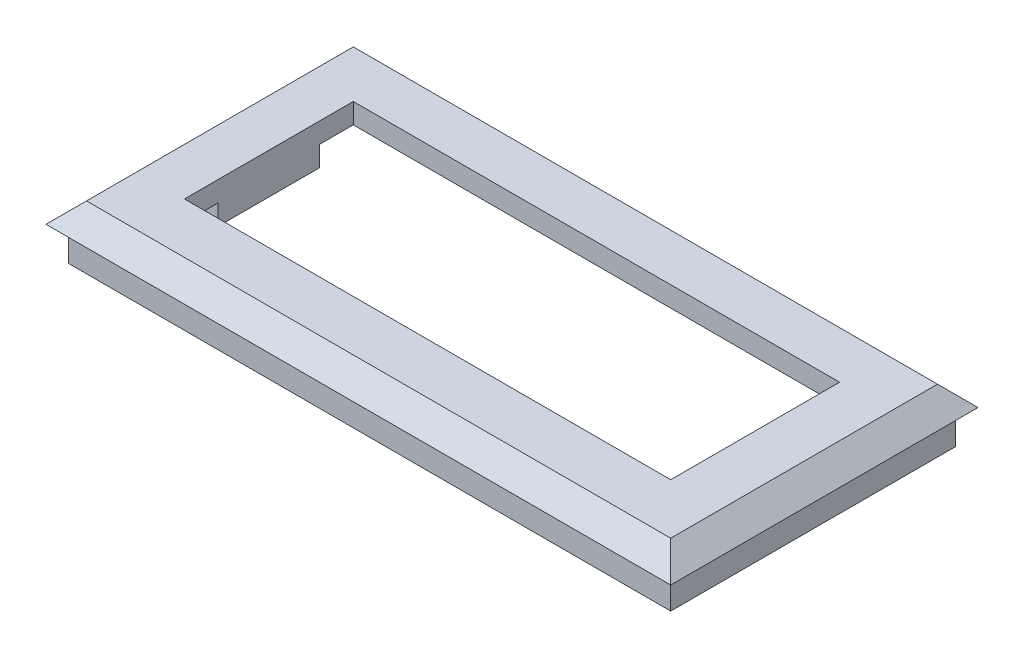
ISO-10303-21;
HEADER;
FILE_DESCRIPTION(('STEP AP214'),'2;1');
FILE_NAME('part.step','',(''),(''),'','','');
FILE_SCHEMA(('AUTOMOTIVE_DESIGN { 1 0 10303 214 1 1 1 1 }'));
ENDSEC;
DATA;
#1=APPLICATION_CONTEXT('core data for automotive mechanical design processes');
#2=APPLICATION_PROTOCOL_DEFINITION('international standard','automotive_design',2000,#1);
#3=PRODUCT_CONTEXT('',#1,'mechanical');
#4=PRODUCT('Part','Part','',(#3));
#5=PRODUCT_RELATED_PRODUCT_CATEGORY('part','',(#4));
#6=PRODUCT_DEFINITION_FORMATION('','',#4);
#7=PRODUCT_DEFINITION_CONTEXT('part definition',#1,'design');
#8=PRODUCT_DEFINITION('design','',#6,#7);
#9=PRODUCT_DEFINITION_SHAPE('','',#8);
#10=(LENGTH_UNIT() NAMED_UNIT(*) SI_UNIT(.MILLI.,.METRE.));
#11=(NAMED_UNIT(*) PLANE_ANGLE_UNIT() SI_UNIT($,.RADIAN.));
#12=(NAMED_UNIT(*) SI_UNIT($,.STERADIAN.) SOLID_ANGLE_UNIT());
#13=UNCERTAINTY_MEASURE_WITH_UNIT(LENGTH_MEASURE(1.E-05),#10,'distance_accuracy_value','');
#14=(GEOMETRIC_REPRESENTATION_CONTEXT(3) GLOBAL_UNCERTAINTY_ASSIGNED_CONTEXT((#13)) GLOBAL_UNIT_ASSIGNED_CONTEXT((#10,
#11,#12)) REPRESENTATION_CONTEXT('',''));
#15=CARTESIAN_POINT('',(0.,0.,0.));
#16=DIRECTION('',(0.,0.,1.));
#17=DIRECTION('',(1.,0.,0.));
#18=AXIS2_PLACEMENT_3D('',#15,#16,#17);
#19=CARTESIAN_POINT('',(0.,-3.,0.));
#20=DIRECTION('',(0.,1.,0.));
#21=DIRECTION('',(0.,0.,1.));
#22=AXIS2_PLACEMENT_3D('',#19,#20,#21);
#23=PLANE('',#22);
#24=DIRECTION('',(0.,0.,1.));
#25=VECTOR('',#24,1.);
#26=CARTESIAN_POINT('',(-46.,-3.,-22.5));
#27=LINE('',#26,#25);
#28=CARTESIAN_POINT('',(-46.,-3.,-22.5));
#29=VERTEX_POINT('',#28);
#30=CARTESIAN_POINT('',(-46.,-3.,23.));
#31=VERTEX_POINT('',#30);
#32=EDGE_CURVE('E159',#29,#31,#27,.T.);
#33=ORIENTED_EDGE('',*,*,#32,.F.);
#34=DIRECTION('',(-1.,0.,0.));
#35=VECTOR('',#34,1.);
#36=CARTESIAN_POINT('',(46.5,-3.,-22.5));
#37=LINE('',#36,#35);
#38=CARTESIAN_POINT('',(46.5,-3.,-22.5));
#39=VERTEX_POINT('',#38);
#40=EDGE_CURVE('E537',#39,#29,#37,.T.);
#41=ORIENTED_EDGE('',*,*,#40,.F.);
#42=DIRECTION('',(0.,0.,-1.));
#43=VECTOR('',#42,1.);
#44=CARTESIAN_POINT('',(46.5,-3.,23.));
#45=LINE('',#44,#43);
#46=CARTESIAN_POINT('',(46.5,-3.,23.));
#47=VERTEX_POINT('',#46);
#48=EDGE_CURVE('E454',#47,#39,#45,.T.);
#49=ORIENTED_EDGE('',*,*,#48,.F.);
#50=DIRECTION('',(1.,0.,0.));
#51=VECTOR('',#50,1.);
#52=CARTESIAN_POINT('',(-46.,-3.,23.));
#53=LINE('',#52,#51);
#54=EDGE_CURVE('E13',#31,#47,#53,.T.);
#55=ORIENTED_EDGE('',*,*,#54,.F.);
#56=EDGE_LOOP('',(#33,#41,#49,#55));
#57=FACE_BOUND('',#56,.T.);
#58=DIRECTION('',(0.,0.,-1.));
#59=VECTOR('',#58,1.);
#60=CARTESIAN_POINT('',(-44.35,-3.,21.35));
#61=LINE('',#60,#59);
#62=CARTESIAN_POINT('',(-44.35,-3.,21.35));
#63=VERTEX_POINT('',#62);
#64=CARTESIAN_POINT('',(-44.35,-3.,-20.85));
#65=VERTEX_POINT('',#64);
#66=EDGE_CURVE('E306',#63,#65,#61,.T.);
#67=ORIENTED_EDGE('',*,*,#66,.F.);
#68=DIRECTION('',(-1.,0.,0.));
#69=VECTOR('',#68,1.);
#70=CARTESIAN_POINT('',(-44.35,-3.,21.35));
#71=LINE('',#70,#69);
#72=CARTESIAN_POINT('',(44.85,-3.,21.35));
#73=VERTEX_POINT('',#72);
#74=EDGE_CURVE('E334',#73,#63,#71,.T.);
#75=ORIENTED_EDGE('',*,*,#74,.F.);
#76=DIRECTION('',(0.,0.,1.));
#77=VECTOR('',#76,1.);
#78=CARTESIAN_POINT('',(44.85,-3.,21.35));
#79=LINE('',#78,#77);
#80=CARTESIAN_POINT('',(44.85,-3.,-20.85));
#81=VERTEX_POINT('',#80);
#82=EDGE_CURVE('E172',#81,#73,#79,.T.);
#83=ORIENTED_EDGE('',*,*,#82,.F.);
#84=DIRECTION('',(1.,0.,0.));
#85=VECTOR('',#84,1.);
#86=CARTESIAN_POINT('',(-44.35,-3.,-20.85));
#87=LINE('',#86,#85);
#88=EDGE_CURVE('E167',#65,#81,#87,.T.);
#89=ORIENTED_EDGE('',*,*,#88,.F.);
#90=EDGE_LOOP('',(#67,#75,#83,#89));
#91=FACE_BOUND('',#90,.T.);
#92=ADVANCED_FACE('F147',(#57,#91),#23,.F.);
#93=DIRECTION('',(-1.,0.,0.));
#94=VECTOR('',#93,1.);
#95=CARTESIAN_POINT('',(-42.85,-3.,19.85));
#96=LINE('',#95,#94);
#97=CARTESIAN_POINT('',(43.35,-3.,19.85));
#98=VERTEX_POINT('',#97);
#99=CARTESIAN_POINT('',(-42.85,-3.,19.85));
#100=VERTEX_POINT('',#99);
#101=EDGE_CURVE('E299',#98,#100,#96,.T.);
#102=ORIENTED_EDGE('',*,*,#101,.T.);
#103=DIRECTION('',(0.,0.,-1.));
#104=VECTOR('',#103,1.);
#105=CARTESIAN_POINT('',(-42.85,-3.,19.85));
#106=LINE('',#105,#104);
#107=CARTESIAN_POINT('',(-42.85,-3.,-19.35));
#108=VERTEX_POINT('',#107);
#109=EDGE_CURVE('E318',#100,#108,#106,.T.);
#110=ORIENTED_EDGE('',*,*,#109,.T.);
#111=DIRECTION('',(1.,0.,0.));
#112=VECTOR('',#111,1.);
#113=CARTESIAN_POINT('',(-42.85,-3.,-19.35));
#114=LINE('',#113,#112);
#115=CARTESIAN_POINT('',(43.35,-3.,-19.35));
#116=VERTEX_POINT('',#115);
#117=EDGE_CURVE('E305',#108,#116,#114,.T.);
#118=ORIENTED_EDGE('',*,*,#117,.T.);
#119=DIRECTION('',(0.,0.,1.));
#120=VECTOR('',#119,1.);
#121=CARTESIAN_POINT('',(43.35,-3.,19.85));
#122=LINE('',#121,#120);
#123=EDGE_CURVE('E321',#116,#98,#122,.T.);
#124=ORIENTED_EDGE('',*,*,#123,.T.);
#125=EDGE_LOOP('',(#102,#110,#118,#124));
#126=FACE_BOUND('',#125,.T.);
#127=DIRECTION('',(-1.,0.,0.));
#128=VECTOR('',#127,1.);
#129=CARTESIAN_POINT('',(-36.,-3.,7.5));
#130=LINE('',#129,#128);
#131=CARTESIAN_POINT('',(-36.,-3.,7.5));
#132=VERTEX_POINT('',#131);
#133=CARTESIAN_POINT('',(-40.,-3.,7.5));
#134=VERTEX_POINT('',#133);
#135=EDGE_CURVE('E357',#132,#134,#130,.T.);
#136=ORIENTED_EDGE('',*,*,#135,.F.);
#137=DIRECTION('',(0.,0.,1.));
#138=VECTOR('',#137,1.);
#139=CARTESIAN_POINT('',(-36.,-3.,0.));
#140=LINE('',#139,#138);
#141=CARTESIAN_POINT('',(-36.,-3.,12.5));
#142=VERTEX_POINT('',#141);
#143=EDGE_CURVE('E413',#132,#142,#140,.T.);
#144=ORIENTED_EDGE('',*,*,#143,.T.);
#145=DIRECTION('',(1.,0.,0.));
#146=VECTOR('',#145,1.);
#147=CARTESIAN_POINT('',(0.,-3.,12.5));
#148=LINE('',#147,#146);
#149=CARTESIAN_POINT('',(36.,-3.,12.5));
#150=VERTEX_POINT('',#149);
#151=EDGE_CURVE('E416',#142,#150,#148,.T.);
#152=ORIENTED_EDGE('',*,*,#151,.T.);
#153=DIRECTION('',(0.,0.,-1.));
#154=VECTOR('',#153,1.);
#155=CARTESIAN_POINT('',(36.,-3.,0.));
#156=LINE('',#155,#154);
#157=CARTESIAN_POINT('',(36.,-3.,-12.5));
#158=VERTEX_POINT('',#157);
#159=EDGE_CURVE('E401',#150,#158,#156,.T.);
#160=ORIENTED_EDGE('',*,*,#159,.T.);
#161=DIRECTION('',(-1.,0.,0.));
#162=VECTOR('',#161,1.);
#163=CARTESIAN_POINT('',(0.,-3.,-12.5));
#164=LINE('',#163,#162);
#165=CARTESIAN_POINT('',(-36.,-3.,-12.5));
#166=VERTEX_POINT('',#165);
#167=EDGE_CURVE('E410',#158,#166,#164,.T.);
#168=ORIENTED_EDGE('',*,*,#167,.T.);
#169=CARTESIAN_POINT('',(-36.,-3.,-7.5));
#170=VERTEX_POINT('',#169);
#171=EDGE_CURVE('E414',#166,#170,#140,.T.);
#172=ORIENTED_EDGE('',*,*,#171,.T.);
#173=DIRECTION('',(1.,0.,0.));
#174=VECTOR('',#173,1.);
#175=CARTESIAN_POINT('',(-36.,-3.,-7.5));
#176=LINE('',#175,#174);
#177=CARTESIAN_POINT('',(-40.,-3.,-7.5));
#178=VERTEX_POINT('',#177);
#179=EDGE_CURVE('E362',#178,#170,#176,.T.);
#180=ORIENTED_EDGE('',*,*,#179,.F.);
#181=DIRECTION('',(0.,0.,-1.));
#182=VECTOR('',#181,1.);
#183=CARTESIAN_POINT('',(-40.,-3.,7.5));
#184=LINE('',#183,#182);
#185=EDGE_CURVE('E371',#134,#178,#184,.T.);
#186=ORIENTED_EDGE('',*,*,#185,.F.);
#187=EDGE_LOOP('',(#136,#144,#152,#160,#168,#172,#180,#186));
#188=FACE_BOUND('',#187,.T.);
#189=ADVANCED_FACE('F492',(#126,#188),#23,.F.);
#190=CARTESIAN_POINT('',(0.,0.,0.));
#191=DIRECTION('',(0.,1.,0.));
#192=DIRECTION('',(0.,0.,1.));
#193=AXIS2_PLACEMENT_3D('',#190,#191,#192);
#194=PLANE('',#193);
#195=DIRECTION('',(1.,0.,0.));
#196=VECTOR('',#195,1.);
#197=CARTESIAN_POINT('',(-36.,0.,12.5));
#198=LINE('',#197,#196);
#199=CARTESIAN_POINT('',(-36.,0.,12.5));
#200=VERTEX_POINT('',#199);
#201=CARTESIAN_POINT('',(36.,0.,12.5));
#202=VERTEX_POINT('',#201);
#203=EDGE_CURVE('E387',#200,#202,#198,.T.);
#204=ORIENTED_EDGE('',*,*,#203,.F.);
#205=DIRECTION('',(0.,0.,1.));
#206=VECTOR('',#205,1.);
#207=CARTESIAN_POINT('',(-36.,0.,12.5));
#208=LINE('',#207,#206);
#209=CARTESIAN_POINT('',(-36.,0.,-12.5));
#210=VERTEX_POINT('',#209);
#211=EDGE_CURVE('E395',#210,#200,#208,.T.);
#212=ORIENTED_EDGE('',*,*,#211,.F.);
#213=DIRECTION('',(-1.,0.,0.));
#214=VECTOR('',#213,1.);
#215=CARTESIAN_POINT('',(-36.,0.,-12.5));
#216=LINE('',#215,#214);
#217=CARTESIAN_POINT('',(36.,0.,-12.5));
#218=VERTEX_POINT('',#217);
#219=EDGE_CURVE('E392',#218,#210,#216,.T.);
#220=ORIENTED_EDGE('',*,*,#219,.F.);
#221=DIRECTION('',(0.,0.,-1.));
#222=VECTOR('',#221,1.);
#223=CARTESIAN_POINT('',(36.,0.,12.5));
#224=LINE('',#223,#222);
#225=EDGE_CURVE('E389',#202,#218,#224,.T.);
#226=ORIENTED_EDGE('',*,*,#225,.F.);
#227=EDGE_LOOP('',(#204,#212,#220,#226));
#228=FACE_BOUND('',#227,.T.);
#229=DIRECTION('',(0.,0.,1.));
#230=VECTOR('',#229,1.);
#231=CARTESIAN_POINT('',(-43.,0.,-19.5));
#232=LINE('',#231,#230);
#233=CARTESIAN_POINT('',(-43.,0.,-19.5));
#234=VERTEX_POINT('',#233);
#235=CARTESIAN_POINT('',(-43.,0.,20.));
#236=VERTEX_POINT('',#235);
#237=EDGE_CURVE('E419',#234,#236,#232,.T.);
#238=ORIENTED_EDGE('',*,*,#237,.T.);
#239=DIRECTION('',(1.,0.,0.));
#240=VECTOR('',#239,1.);
#241=CARTESIAN_POINT('',(-43.,0.,20.));
#242=LINE('',#241,#240);
#243=CARTESIAN_POINT('',(43.5,0.,20.));
#244=VERTEX_POINT('',#243);
#245=EDGE_CURVE('E510',#236,#244,#242,.T.);
#246=ORIENTED_EDGE('',*,*,#245,.T.);
#247=DIRECTION('',(0.,0.,1.));
#248=VECTOR('',#247,1.);
#249=CARTESIAN_POINT('',(43.5,0.,-19.5));
#250=LINE('',#249,#248);
#251=CARTESIAN_POINT('',(43.5,0.,-19.5));
#252=VERTEX_POINT('',#251);
#253=EDGE_CURVE('E470',#252,#244,#250,.T.);
#254=ORIENTED_EDGE('',*,*,#253,.F.);
#255=DIRECTION('',(1.,0.,0.));
#256=VECTOR('',#255,1.);
#257=CARTESIAN_POINT('',(-43.,0.,-19.5));
#258=LINE('',#257,#256);
#259=EDGE_CURVE('E424',#234,#252,#258,.T.);
#260=ORIENTED_EDGE('',*,*,#259,.F.);
#261=EDGE_LOOP('',(#238,#246,#254,#260));
#262=FACE_BOUND('',#261,.T.);
#263=ADVANCED_FACE('F482',(#228,#262),#194,.T.);
#264=CARTESIAN_POINT('',(43.5,0.,20.));
#265=DIRECTION('',(0.,0.707106781186547,0.707106781186548));
#266=DIRECTION('',(-1.,0.,0.));
#267=AXIS2_PLACEMENT_3D('',#264,#265,#266);
#268=PLANE('',#267);
#269=ORIENTED_EDGE('',*,*,#245,.F.);
#270=CARTESIAN_POINT('',(-43.,0.,20.));
#271=CARTESIAN_POINT('',(-44.,-1.,21.));
#272=CARTESIAN_POINT('',(-45.,-2.,22.));
#273=CARTESIAN_POINT('',(-46.,-3.,23.));
#274=B_SPLINE_CURVE_WITH_KNOTS('',3,(#270,#271,#272,#273),.UNSPECIFIED.,.F.,.F.,(4,4),(0.,1.),.UNSPECIFIED.);
#275=EDGE_CURVE('E444',#236,#31,#274,.T.);
#276=ORIENTED_EDGE('',*,*,#275,.T.);
#277=ORIENTED_EDGE('',*,*,#54,.T.);
#278=CARTESIAN_POINT('',(43.5,0.,20.));
#279=CARTESIAN_POINT('',(44.5,-1.,21.));
#280=CARTESIAN_POINT('',(45.5,-2.,22.));
#281=CARTESIAN_POINT('',(46.5,-3.,23.));
#282=B_SPLINE_CURVE_WITH_KNOTS('',3,(#278,#279,#280,#281),.UNSPECIFIED.,.F.,.F.,(4,4),(0.,1.),.UNSPECIFIED.);
#283=EDGE_CURVE('E434',#244,#47,#282,.T.);
#284=ORIENTED_EDGE('',*,*,#283,.F.);
#285=EDGE_LOOP('',(#269,#276,#277,#284));
#286=FACE_BOUND('',#285,.T.);
#287=ADVANCED_FACE('F491',(#286),#268,.T.);
#288=CARTESIAN_POINT('',(43.5,0.,-19.5));
#289=DIRECTION('',(0.707106781186547,0.707106781186548,0.));
#290=DIRECTION('',(0.,0.,1.));
#291=AXIS2_PLACEMENT_3D('',#288,#289,#290);
#292=PLANE('',#291);
#293=ORIENTED_EDGE('',*,*,#253,.T.);
#294=ORIENTED_EDGE('',*,*,#283,.T.);
#295=ORIENTED_EDGE('',*,*,#48,.T.);
#296=CARTESIAN_POINT('',(43.5,0.,-19.5));
#297=CARTESIAN_POINT('',(44.5,-1.,-20.5));
#298=CARTESIAN_POINT('',(45.5,-2.,-21.5));
#299=CARTESIAN_POINT('',(46.5,-3.,-22.5));
#300=B_SPLINE_CURVE_WITH_KNOTS('',3,(#296,#297,#298,#299),.UNSPECIFIED.,.F.,.F.,(4,4),(0.,1.),.UNSPECIFIED.);
#301=EDGE_CURVE('E423',#252,#39,#300,.T.);
#302=ORIENTED_EDGE('',*,*,#301,.F.);
#303=EDGE_LOOP('',(#293,#294,#295,#302));
#304=FACE_BOUND('',#303,.T.);
#305=ADVANCED_FACE('F559',(#304),#292,.T.);
#306=CARTESIAN_POINT('',(-43.,0.,-19.5));
#307=DIRECTION('',(0.,0.707106781186547,-0.707106781186548));
#308=DIRECTION('',(1.,0.,0.));
#309=AXIS2_PLACEMENT_3D('',#306,#307,#308);
#310=PLANE('',#309);
#311=ORIENTED_EDGE('',*,*,#259,.T.);
#312=ORIENTED_EDGE('',*,*,#301,.T.);
#313=ORIENTED_EDGE('',*,*,#40,.T.);
#314=CARTESIAN_POINT('',(-43.,0.,-19.5));
#315=CARTESIAN_POINT('',(-44.,-1.,-20.5));
#316=CARTESIAN_POINT('',(-45.,-2.,-21.5));
#317=CARTESIAN_POINT('',(-46.,-3.,-22.5));
#318=B_SPLINE_CURVE_WITH_KNOTS('',3,(#314,#315,#316,#317),.UNSPECIFIED.,.F.,.F.,(4,4),(0.,1.),.UNSPECIFIED.);
#319=EDGE_CURVE('E420',#234,#29,#318,.T.);
#320=ORIENTED_EDGE('',*,*,#319,.F.);
#321=EDGE_LOOP('',(#311,#312,#313,#320));
#322=FACE_BOUND('',#321,.T.);
#323=ADVANCED_FACE('F598',(#322),#310,.T.);
#324=CARTESIAN_POINT('',(-43.,0.,20.));
#325=DIRECTION('',(-0.707106781186547,0.707106781186548,0.));
#326=DIRECTION('',(0.,0.,-1.));
#327=AXIS2_PLACEMENT_3D('',#324,#325,#326);
#328=PLANE('',#327);
#329=ORIENTED_EDGE('',*,*,#237,.F.);
#330=ORIENTED_EDGE('',*,*,#319,.T.);
#331=ORIENTED_EDGE('',*,*,#32,.T.);
#332=ORIENTED_EDGE('',*,*,#275,.F.);
#333=EDGE_LOOP('',(#329,#330,#331,#332));
#334=FACE_BOUND('',#333,.T.);
#335=ADVANCED_FACE('F149',(#334),#328,.T.);
#336=CARTESIAN_POINT('',(-36.,-6.,12.5));
#337=DIRECTION('',(0.,0.,1.));
#338=DIRECTION('',(1.,0.,0.));
#339=AXIS2_PLACEMENT_3D('',#336,#337,#338);
#340=PLANE('',#339);
#341=DIRECTION('',(0.,1.,0.));
#342=VECTOR('',#341,1.);
#343=CARTESIAN_POINT('',(-36.,-6.,12.5));
#344=LINE('',#343,#342);
#345=EDGE_CURVE('E399',#142,#200,#344,.T.);
#346=ORIENTED_EDGE('',*,*,#345,.T.);
#347=ORIENTED_EDGE('',*,*,#203,.T.);
#348=DIRECTION('',(0.,1.,0.));
#349=VECTOR('',#348,1.);
#350=CARTESIAN_POINT('',(36.,-6.,12.5));
#351=LINE('',#350,#349);
#352=EDGE_CURVE('E398',#150,#202,#351,.T.);
#353=ORIENTED_EDGE('',*,*,#352,.F.);
#354=ORIENTED_EDGE('',*,*,#151,.F.);
#355=EDGE_LOOP('',(#346,#347,#353,#354));
#356=FACE_BOUND('',#355,.T.);
#357=ADVANCED_FACE('F494',(#356),#340,.F.);
#358=CARTESIAN_POINT('',(-36.,-6.,12.5));
#359=DIRECTION('',(-1.,0.,0.));
#360=DIRECTION('',(0.,0.,1.));
#361=AXIS2_PLACEMENT_3D('',#358,#359,#360);
#362=PLANE('',#361);
#363=DIRECTION('',(0.,1.,0.));
#364=VECTOR('',#363,1.);
#365=CARTESIAN_POINT('',(-36.,-6.,-12.5));
#366=LINE('',#365,#364);
#367=EDGE_CURVE('E402',#166,#210,#366,.T.);
#368=ORIENTED_EDGE('',*,*,#367,.T.);
#369=ORIENTED_EDGE('',*,*,#211,.T.);
#370=ORIENTED_EDGE('',*,*,#345,.F.);
#371=ORIENTED_EDGE('',*,*,#143,.F.);
#372=DIRECTION('',(0.,1.,0.));
#373=VECTOR('',#372,1.);
#374=CARTESIAN_POINT('',(-36.,-6.,7.5));
#375=LINE('',#374,#373);
#376=CARTESIAN_POINT('',(-36.,-6.,7.5));
#377=VERTEX_POINT('',#376);
#378=EDGE_CURVE('E384',#377,#132,#375,.T.);
#379=ORIENTED_EDGE('',*,*,#378,.F.);
#380=DIRECTION('',(0.,0.,1.));
#381=VECTOR('',#380,1.);
#382=CARTESIAN_POINT('',(-36.,-6.,7.5));
#383=LINE('',#382,#381);
#384=CARTESIAN_POINT('',(-36.,-6.,-7.5));
#385=VERTEX_POINT('',#384);
#386=EDGE_CURVE('E358',#385,#377,#383,.T.);
#387=ORIENTED_EDGE('',*,*,#386,.F.);
#388=DIRECTION('',(0.,1.,0.));
#389=VECTOR('',#388,1.);
#390=CARTESIAN_POINT('',(-36.,-6.,-7.5));
#391=LINE('',#390,#389);
#392=EDGE_CURVE('E368',#385,#170,#391,.T.);
#393=ORIENTED_EDGE('',*,*,#392,.T.);
#394=ORIENTED_EDGE('',*,*,#171,.F.);
#395=EDGE_LOOP('',(#368,#369,#370,#371,#379,#387,#393,#394));
#396=FACE_BOUND('',#395,.T.);
#397=ADVANCED_FACE('F679',(#396),#362,.F.);
#398=CARTESIAN_POINT('',(-36.,-6.,-12.5));
#399=DIRECTION('',(0.,0.,-1.));
#400=DIRECTION('',(-1.,0.,0.));
#401=AXIS2_PLACEMENT_3D('',#398,#399,#400);
#402=PLANE('',#401);
#403=DIRECTION('',(0.,1.,0.));
#404=VECTOR('',#403,1.);
#405=CARTESIAN_POINT('',(36.,-6.,-12.5));
#406=LINE('',#405,#404);
#407=EDGE_CURVE('E404',#158,#218,#406,.T.);
#408=ORIENTED_EDGE('',*,*,#407,.T.);
#409=ORIENTED_EDGE('',*,*,#219,.T.);
#410=ORIENTED_EDGE('',*,*,#367,.F.);
#411=ORIENTED_EDGE('',*,*,#167,.F.);
#412=EDGE_LOOP('',(#408,#409,#410,#411));
#413=FACE_BOUND('',#412,.T.);
#414=ADVANCED_FACE('F692',(#413),#402,.F.);
#415=CARTESIAN_POINT('',(36.,-6.,12.5));
#416=DIRECTION('',(1.,0.,0.));
#417=DIRECTION('',(0.,0.,-1.));
#418=AXIS2_PLACEMENT_3D('',#415,#416,#417);
#419=PLANE('',#418);
#420=ORIENTED_EDGE('',*,*,#352,.T.);
#421=ORIENTED_EDGE('',*,*,#225,.T.);
#422=ORIENTED_EDGE('',*,*,#407,.F.);
#423=ORIENTED_EDGE('',*,*,#159,.F.);
#424=EDGE_LOOP('',(#420,#421,#422,#423));
#425=FACE_BOUND('',#424,.T.);
#426=ADVANCED_FACE('F687',(#425),#419,.F.);
#427=CARTESIAN_POINT('',(-36.,-6.,7.5));
#428=DIRECTION('',(0.,0.,-1.));
#429=DIRECTION('',(-1.,0.,0.));
#430=AXIS2_PLACEMENT_3D('',#427,#428,#429);
#431=PLANE('',#430);
#432=ORIENTED_EDGE('',*,*,#135,.T.);
#433=DIRECTION('',(0.,1.,0.));
#434=VECTOR('',#433,1.);
#435=CARTESIAN_POINT('',(-40.,-6.,7.5));
#436=LINE('',#435,#434);
#437=CARTESIAN_POINT('',(-40.,-6.,7.5));
#438=VERTEX_POINT('',#437);
#439=EDGE_CURVE('E381',#438,#134,#436,.T.);
#440=ORIENTED_EDGE('',*,*,#439,.F.);
#441=DIRECTION('',(-1.,0.,0.));
#442=VECTOR('',#441,1.);
#443=CARTESIAN_POINT('',(-36.,-6.,7.5));
#444=LINE('',#443,#442);
#445=EDGE_CURVE('E361',#377,#438,#444,.T.);
#446=ORIENTED_EDGE('',*,*,#445,.F.);
#447=ORIENTED_EDGE('',*,*,#378,.T.);
#448=EDGE_LOOP('',(#432,#440,#446,#447));
#449=FACE_BOUND('',#448,.T.);
#450=ADVANCED_FACE('F676',(#449),#431,.F.);
#451=CARTESIAN_POINT('',(-40.,-6.,7.5));
#452=DIRECTION('',(1.,0.,0.));
#453=DIRECTION('',(0.,0.,-1.));
#454=AXIS2_PLACEMENT_3D('',#451,#452,#453);
#455=PLANE('',#454);
#456=ORIENTED_EDGE('',*,*,#185,.T.);
#457=DIRECTION('',(0.,1.,0.));
#458=VECTOR('',#457,1.);
#459=CARTESIAN_POINT('',(-40.,-6.,-7.5));
#460=LINE('',#459,#458);
#461=CARTESIAN_POINT('',(-40.,-6.,-7.5));
#462=VERTEX_POINT('',#461);
#463=EDGE_CURVE('E378',#462,#178,#460,.T.);
#464=ORIENTED_EDGE('',*,*,#463,.F.);
#465=DIRECTION('',(0.,0.,-1.));
#466=VECTOR('',#465,1.);
#467=CARTESIAN_POINT('',(-40.,-6.,7.5));
#468=LINE('',#467,#466);
#469=EDGE_CURVE('E364',#438,#462,#468,.T.);
#470=ORIENTED_EDGE('',*,*,#469,.F.);
#471=ORIENTED_EDGE('',*,*,#439,.T.);
#472=EDGE_LOOP('',(#456,#464,#470,#471));
#473=FACE_BOUND('',#472,.T.);
#474=ADVANCED_FACE('F700',(#473),#455,.F.);
#475=CARTESIAN_POINT('',(-36.,-6.,-7.5));
#476=DIRECTION('',(0.,0.,1.));
#477=DIRECTION('',(1.,0.,0.));
#478=AXIS2_PLACEMENT_3D('',#475,#476,#477);
#479=PLANE('',#478);
#480=ORIENTED_EDGE('',*,*,#179,.T.);
#481=ORIENTED_EDGE('',*,*,#392,.F.);
#482=DIRECTION('',(1.,0.,0.));
#483=VECTOR('',#482,1.);
#484=CARTESIAN_POINT('',(-36.,-6.,-7.5));
#485=LINE('',#484,#483);
#486=EDGE_CURVE('E366',#462,#385,#485,.T.);
#487=ORIENTED_EDGE('',*,*,#486,.F.);
#488=ORIENTED_EDGE('',*,*,#463,.T.);
#489=EDGE_LOOP('',(#480,#481,#487,#488));
#490=FACE_BOUND('',#489,.T.);
#491=ADVANCED_FACE('F695',(#490),#479,.F.);
#492=CARTESIAN_POINT('',(0.,-6.,0.));
#493=DIRECTION('',(0.,1.,0.));
#494=DIRECTION('',(0.,0.,1.));
#495=AXIS2_PLACEMENT_3D('',#492,#493,#494);
#496=PLANE('',#495);
#497=ORIENTED_EDGE('',*,*,#386,.T.);
#498=ORIENTED_EDGE('',*,*,#445,.T.);
#499=ORIENTED_EDGE('',*,*,#469,.T.);
#500=ORIENTED_EDGE('',*,*,#486,.T.);
#501=EDGE_LOOP('',(#497,#498,#499,#500));
#502=FACE_BOUND('',#501,.T.);
#503=ADVANCED_FACE('F702',(#502),#496,.F.);
#504=CARTESIAN_POINT('',(0.,-8.,0.));
#505=DIRECTION('',(0.,-1.,0.));
#506=DIRECTION('',(0.,0.,-1.));
#507=AXIS2_PLACEMENT_3D('',#504,#505,#506);
#508=PLANE('',#507);
#509=DIRECTION('',(0.,0.,-1.));
#510=VECTOR('',#509,1.);
#511=CARTESIAN_POINT('',(-44.35,-8.,21.35));
#512=LINE('',#511,#510);
#513=CARTESIAN_POINT('',(-44.35,-8.,21.35));
#514=VERTEX_POINT('',#513);
#515=CARTESIAN_POINT('',(-44.35,-8.,-20.85));
#516=VERTEX_POINT('',#515);
#517=EDGE_CURVE('E330',#514,#516,#512,.T.);
#518=ORIENTED_EDGE('',*,*,#517,.T.);
#519=DIRECTION('',(1.,0.,0.));
#520=VECTOR('',#519,1.);
#521=CARTESIAN_POINT('',(-44.35,-8.,-20.85));
#522=LINE('',#521,#520);
#523=CARTESIAN_POINT('',(44.85,-8.,-20.85));
#524=VERTEX_POINT('',#523);
#525=EDGE_CURVE('E333',#516,#524,#522,.T.);
#526=ORIENTED_EDGE('',*,*,#525,.T.);
#527=DIRECTION('',(0.,0.,1.));
#528=VECTOR('',#527,1.);
#529=CARTESIAN_POINT('',(44.85,-8.,21.35));
#530=LINE('',#529,#528);
#531=CARTESIAN_POINT('',(44.85,-8.,21.35));
#532=VERTEX_POINT('',#531);
#533=EDGE_CURVE('E336',#524,#532,#530,.T.);
#534=ORIENTED_EDGE('',*,*,#533,.T.);
#535=DIRECTION('',(-1.,0.,0.));
#536=VECTOR('',#535,1.);
#537=CARTESIAN_POINT('',(-44.35,-8.,21.35));
#538=LINE('',#537,#536);
#539=EDGE_CURVE('E338',#532,#514,#538,.T.);
#540=ORIENTED_EDGE('',*,*,#539,.T.);
#541=EDGE_LOOP('',(#518,#526,#534,#540));
#542=FACE_BOUND('',#541,.T.);
#543=DIRECTION('',(1.,0.,0.));
#544=VECTOR('',#543,1.);
#545=CARTESIAN_POINT('',(-42.85,-8.,-19.35));
#546=LINE('',#545,#544);
#547=CARTESIAN_POINT('',(-42.85,-8.,-19.35));
#548=VERTEX_POINT('',#547);
#549=CARTESIAN_POINT('',(43.35,-8.,-19.35));
#550=VERTEX_POINT('',#549);
#551=EDGE_CURVE('E298',#548,#550,#546,.T.);
#552=ORIENTED_EDGE('',*,*,#551,.F.);
#553=DIRECTION('',(0.,0.,-1.));
#554=VECTOR('',#553,1.);
#555=CARTESIAN_POINT('',(-42.85,-8.,19.85));
#556=LINE('',#555,#554);
#557=CARTESIAN_POINT('',(-42.85,-8.,19.85));
#558=VERTEX_POINT('',#557);
#559=EDGE_CURVE('E288',#558,#548,#556,.T.);
#560=ORIENTED_EDGE('',*,*,#559,.F.);
#561=DIRECTION('',(-1.,0.,0.));
#562=VECTOR('',#561,1.);
#563=CARTESIAN_POINT('',(-42.85,-8.,19.85));
#564=LINE('',#563,#562);
#565=CARTESIAN_POINT('',(43.35,-8.,19.85));
#566=VERTEX_POINT('',#565);
#567=EDGE_CURVE('E314',#566,#558,#564,.T.);
#568=ORIENTED_EDGE('',*,*,#567,.F.);
#569=DIRECTION('',(0.,0.,1.));
#570=VECTOR('',#569,1.);
#571=CARTESIAN_POINT('',(43.35,-8.,19.85));
#572=LINE('',#571,#570);
#573=EDGE_CURVE('E312',#550,#566,#572,.T.);
#574=ORIENTED_EDGE('',*,*,#573,.F.);
#575=EDGE_LOOP('',(#552,#560,#568,#574));
#576=FACE_BOUND('',#575,.T.);
#577=ADVANCED_FACE('F310',(#542,#576),#508,.T.);
#578=CARTESIAN_POINT('',(-44.35,-8.,21.35));
#579=DIRECTION('',(1.,0.,0.));
#580=DIRECTION('',(0.,0.,-1.));
#581=AXIS2_PLACEMENT_3D('',#578,#579,#580);
#582=PLANE('',#581);
#583=ORIENTED_EDGE('',*,*,#66,.T.);
#584=DIRECTION('',(0.,1.,0.));
#585=VECTOR('',#584,1.);
#586=CARTESIAN_POINT('',(-44.35,-8.,-20.85));
#587=LINE('',#586,#585);
#588=EDGE_CURVE('E355',#516,#65,#587,.T.);
#589=ORIENTED_EDGE('',*,*,#588,.F.);
#590=ORIENTED_EDGE('',*,*,#517,.F.);
#591=DIRECTION('',(0.,1.,0.));
#592=VECTOR('',#591,1.);
#593=CARTESIAN_POINT('',(-44.35,-8.,21.35));
#594=LINE('',#593,#592);
#595=EDGE_CURVE('E340',#514,#63,#594,.T.);
#596=ORIENTED_EDGE('',*,*,#595,.T.);
#597=EDGE_LOOP('',(#583,#589,#590,#596));
#598=FACE_BOUND('',#597,.T.);
#599=ADVANCED_FACE('F709',(#598),#582,.F.);
#600=CARTESIAN_POINT('',(-44.35,-8.,-20.85));
#601=DIRECTION('',(0.,0.,1.));
#602=DIRECTION('',(1.,0.,0.));
#603=AXIS2_PLACEMENT_3D('',#600,#601,#602);
#604=PLANE('',#603);
#605=ORIENTED_EDGE('',*,*,#88,.T.);
#606=DIRECTION('',(0.,1.,0.));
#607=VECTOR('',#606,1.);
#608=CARTESIAN_POINT('',(44.85,-8.,-20.85));
#609=LINE('',#608,#607);
#610=EDGE_CURVE('E352',#524,#81,#609,.T.);
#611=ORIENTED_EDGE('',*,*,#610,.F.);
#612=ORIENTED_EDGE('',*,*,#525,.F.);
#613=ORIENTED_EDGE('',*,*,#588,.T.);
#614=EDGE_LOOP('',(#605,#611,#612,#613));
#615=FACE_BOUND('',#614,.T.);
#616=ADVANCED_FACE('F796',(#615),#604,.F.);
#617=CARTESIAN_POINT('',(44.85,-8.,21.35));
#618=DIRECTION('',(-1.,0.,0.));
#619=DIRECTION('',(0.,0.,1.));
#620=AXIS2_PLACEMENT_3D('',#617,#618,#619);
#621=PLANE('',#620);
#622=ORIENTED_EDGE('',*,*,#82,.T.);
#623=DIRECTION('',(0.,1.,0.));
#624=VECTOR('',#623,1.);
#625=CARTESIAN_POINT('',(44.85,-8.,21.35));
#626=LINE('',#625,#624);
#627=EDGE_CURVE('E349',#532,#73,#626,.T.);
#628=ORIENTED_EDGE('',*,*,#627,.F.);
#629=ORIENTED_EDGE('',*,*,#533,.F.);
#630=ORIENTED_EDGE('',*,*,#610,.T.);
#631=EDGE_LOOP('',(#622,#628,#629,#630));
#632=FACE_BOUND('',#631,.T.);
#633=ADVANCED_FACE('F805',(#632),#621,.F.);
#634=CARTESIAN_POINT('',(-44.35,-8.,21.35));
#635=DIRECTION('',(0.,0.,-1.));
#636=DIRECTION('',(-1.,0.,0.));
#637=AXIS2_PLACEMENT_3D('',#634,#635,#636);
#638=PLANE('',#637);
#639=ORIENTED_EDGE('',*,*,#74,.T.);
#640=ORIENTED_EDGE('',*,*,#595,.F.);
#641=ORIENTED_EDGE('',*,*,#539,.F.);
#642=ORIENTED_EDGE('',*,*,#627,.T.);
#643=EDGE_LOOP('',(#639,#640,#641,#642));
#644=FACE_BOUND('',#643,.T.);
#645=ADVANCED_FACE('F814',(#644),#638,.F.);
#646=CARTESIAN_POINT('',(-42.85,-8.,19.85));
#647=DIRECTION('',(1.,0.,0.));
#648=DIRECTION('',(0.,0.,-1.));
#649=AXIS2_PLACEMENT_3D('',#646,#647,#648);
#650=PLANE('',#649);
#651=ORIENTED_EDGE('',*,*,#109,.F.);
#652=DIRECTION('',(0.,1.,0.));
#653=VECTOR('',#652,1.);
#654=CARTESIAN_POINT('',(-42.85,-8.,19.85));
#655=LINE('',#654,#653);
#656=EDGE_CURVE('E294',#558,#100,#655,.T.);
#657=ORIENTED_EDGE('',*,*,#656,.F.);
#658=ORIENTED_EDGE('',*,*,#559,.T.);
#659=DIRECTION('',(0.,1.,0.));
#660=VECTOR('',#659,1.);
#661=CARTESIAN_POINT('',(-42.85,-8.,-19.35));
#662=LINE('',#661,#660);
#663=EDGE_CURVE('E292',#548,#108,#662,.T.);
#664=ORIENTED_EDGE('',*,*,#663,.T.);
#665=EDGE_LOOP('',(#651,#657,#658,#664));
#666=FACE_BOUND('',#665,.T.);
#667=ADVANCED_FACE('F291',(#666),#650,.T.);
#668=CARTESIAN_POINT('',(-42.85,-8.,-19.35));
#669=DIRECTION('',(0.,0.,1.));
#670=DIRECTION('',(1.,0.,0.));
#671=AXIS2_PLACEMENT_3D('',#668,#669,#670);
#672=PLANE('',#671);
#673=ORIENTED_EDGE('',*,*,#117,.F.);
#674=ORIENTED_EDGE('',*,*,#663,.F.);
#675=ORIENTED_EDGE('',*,*,#551,.T.);
#676=DIRECTION('',(0.,1.,0.));
#677=VECTOR('',#676,1.);
#678=CARTESIAN_POINT('',(43.35,-8.,-19.35));
#679=LINE('',#678,#677);
#680=EDGE_CURVE('E307',#550,#116,#679,.T.);
#681=ORIENTED_EDGE('',*,*,#680,.T.);
#682=EDGE_LOOP('',(#673,#674,#675,#681));
#683=FACE_BOUND('',#682,.T.);
#684=ADVANCED_FACE('F302',(#683),#672,.T.);
#685=CARTESIAN_POINT('',(43.35,-8.,19.85));
#686=DIRECTION('',(-1.,0.,0.));
#687=DIRECTION('',(0.,0.,1.));
#688=AXIS2_PLACEMENT_3D('',#685,#686,#687);
#689=PLANE('',#688);
#690=ORIENTED_EDGE('',*,*,#123,.F.);
#691=ORIENTED_EDGE('',*,*,#680,.F.);
#692=ORIENTED_EDGE('',*,*,#573,.T.);
#693=DIRECTION('',(0.,1.,0.));
#694=VECTOR('',#693,1.);
#695=CARTESIAN_POINT('',(43.35,-8.,19.85));
#696=LINE('',#695,#694);
#697=EDGE_CURVE('E327',#566,#98,#696,.T.);
#698=ORIENTED_EDGE('',*,*,#697,.T.);
#699=EDGE_LOOP('',(#690,#691,#692,#698));
#700=FACE_BOUND('',#699,.T.);
#701=ADVANCED_FACE('F841',(#700),#689,.T.);
#702=CARTESIAN_POINT('',(-42.85,-8.,19.85));
#703=DIRECTION('',(0.,0.,-1.));
#704=DIRECTION('',(-1.,0.,0.));
#705=AXIS2_PLACEMENT_3D('',#702,#703,#704);
#706=PLANE('',#705);
#707=ORIENTED_EDGE('',*,*,#101,.F.);
#708=ORIENTED_EDGE('',*,*,#697,.F.);
#709=ORIENTED_EDGE('',*,*,#567,.T.);
#710=ORIENTED_EDGE('',*,*,#656,.T.);
#711=EDGE_LOOP('',(#707,#708,#709,#710));
#712=FACE_BOUND('',#711,.T.);
#713=ADVANCED_FACE('F850',(#712),#706,.T.);
#714=CLOSED_SHELL('',(#92,#189,#263,#287,#305,#323,#335,#357,#397,#414,#426,#450,#474,#491,#503,
#577,#599,#616,#633,#645,#667,#684,#701,#713));
#715=MANIFOLD_SOLID_BREP('B2',#714);
#716=ADVANCED_BREP_SHAPE_REPRESENTATION('',(#18,#715),#14);
#717=SHAPE_DEFINITION_REPRESENTATION(#9,#716);
ENDSEC;
END-ISO-10303-21;
